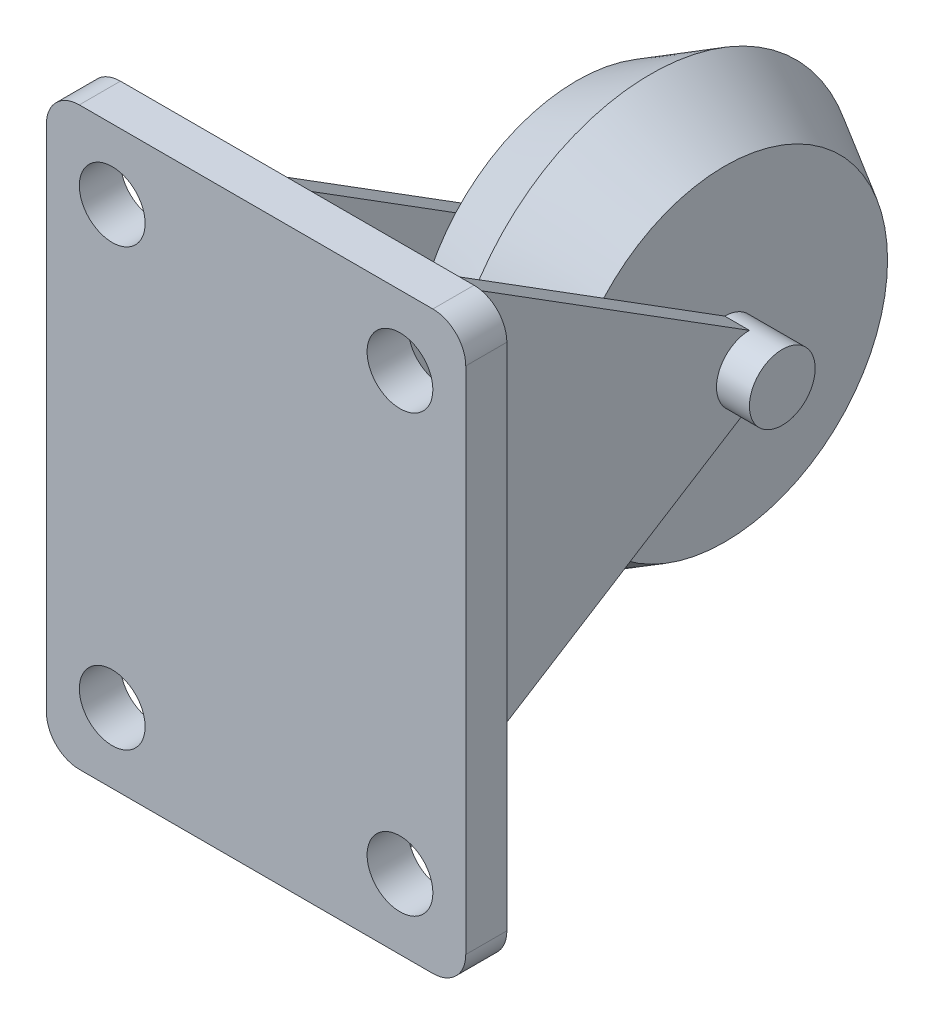
ISO-10303-21;
HEADER;
FILE_DESCRIPTION(('STEP AP214'),'2;1');
FILE_NAME('part.step','',(''),(''),'','','');
FILE_SCHEMA(('AUTOMOTIVE_DESIGN { 1 0 10303 214 1 1 1 1 }'));
ENDSEC;
DATA;
#1=APPLICATION_CONTEXT('core data for automotive mechanical design processes');
#2=APPLICATION_PROTOCOL_DEFINITION('international standard','automotive_design',2000,#1);
#3=PRODUCT_CONTEXT('',#1,'mechanical');
#4=PRODUCT('Part','Part','',(#3));
#5=PRODUCT_RELATED_PRODUCT_CATEGORY('part','',(#4));
#6=PRODUCT_DEFINITION_FORMATION('','',#4);
#7=PRODUCT_DEFINITION_CONTEXT('part definition',#1,'design');
#8=PRODUCT_DEFINITION('design','',#6,#7);
#9=PRODUCT_DEFINITION_SHAPE('','',#8);
#10=(LENGTH_UNIT() NAMED_UNIT(*) SI_UNIT(.MILLI.,.METRE.));
#11=(NAMED_UNIT(*) PLANE_ANGLE_UNIT() SI_UNIT($,.RADIAN.));
#12=(NAMED_UNIT(*) SI_UNIT($,.STERADIAN.) SOLID_ANGLE_UNIT());
#13=UNCERTAINTY_MEASURE_WITH_UNIT(LENGTH_MEASURE(1.E-05),#10,'distance_accuracy_value','');
#14=(GEOMETRIC_REPRESENTATION_CONTEXT(3) GLOBAL_UNCERTAINTY_ASSIGNED_CONTEXT((#13)) GLOBAL_UNIT_ASSIGNED_CONTEXT((#10,
#11,#12)) REPRESENTATION_CONTEXT('',''));
#15=CARTESIAN_POINT('',(0.,0.,0.));
#16=DIRECTION('',(0.,0.,1.));
#17=DIRECTION('',(1.,0.,0.));
#18=AXIS2_PLACEMENT_3D('',#15,#16,#17);
#19=CARTESIAN_POINT('',(-12.,-22.233902249806,-13.9608223429015));
#20=DIRECTION('',(0.,0.846889988853068,0.531768132535647));
#21=DIRECTION('',(0.,-0.531768132535647,0.846889988853068));
#22=AXIS2_PLACEMENT_3D('',#19,#20,#21);
#23=PLANE('',#22);
#24=DIRECTION('',(0.,-0.531768132535647,0.846889988853068));
#25=VECTOR('',#24,1.);
#26=CARTESIAN_POINT('',(-8.99999999999995,-22.2339022498061,-13.9608223429015));
#27=LINE('',#26,#25);
#28=CARTESIAN_POINT('',(-8.99999999999998,-4.,-43.));
#29=VERTEX_POINT('',#28);
#30=CARTESIAN_POINT('',(-8.99999999999995,-13.2447323242774,-28.2769077798545));
#31=VERTEX_POINT('',#30);
#32=EDGE_CURVE('E163',#29,#31,#27,.T.);
#33=ORIENTED_EDGE('',*,*,#32,.T.);
#34=CARTESIAN_POINT('',(-9.00000000000001,-31.,0.));
#35=VERTEX_POINT('',#34);
#36=EDGE_CURVE('E165',#31,#35,#27,.T.);
#37=ORIENTED_EDGE('',*,*,#36,.T.);
#38=DIRECTION('',(1.,0.,0.));
#39=VECTOR('',#38,1.);
#40=CARTESIAN_POINT('',(-12.,-31.,0.));
#41=LINE('',#40,#39);
#42=CARTESIAN_POINT('',(-12.,-31.,0.));
#43=VERTEX_POINT('',#42);
#44=EDGE_CURVE('E237',#43,#35,#41,.T.);
#45=ORIENTED_EDGE('',*,*,#44,.F.);
#46=DIRECTION('',(0.,-0.531768132535647,0.846889988853068));
#47=VECTOR('',#46,1.);
#48=CARTESIAN_POINT('',(-12.,-22.233902249806,-13.9608223429015));
#49=LINE('',#48,#47);
#50=CARTESIAN_POINT('',(-12.,-4.,-43.));
#51=VERTEX_POINT('',#50);
#52=EDGE_CURVE('E226',#51,#43,#49,.T.);
#53=ORIENTED_EDGE('',*,*,#52,.F.);
#54=DIRECTION('',(1.,0.,0.));
#55=VECTOR('',#54,1.);
#56=CARTESIAN_POINT('',(-12.,-4.,-43.));
#57=LINE('',#56,#55);
#58=EDGE_CURVE('E169',#51,#29,#57,.T.);
#59=ORIENTED_EDGE('',*,*,#58,.T.);
#60=EDGE_LOOP('',(#33,#37,#45,#53,#59));
#61=FACE_BOUND('',#60,.T.);
#62=ADVANCED_FACE('F36',(#61),#23,.F.);
#63=CARTESIAN_POINT('',(-12.,22.233902249806,-13.9608223429015));
#64=DIRECTION('',(0.,0.846889988853068,-0.531768132535647));
#65=DIRECTION('',(0.,0.531768132535647,0.846889988853069));
#66=AXIS2_PLACEMENT_3D('',#63,#64,#65);
#67=PLANE('',#66);
#68=DIRECTION('',(1.,0.,0.));
#69=VECTOR('',#68,1.);
#70=CARTESIAN_POINT('',(-12.,31.,0.));
#71=LINE('',#70,#69);
#72=CARTESIAN_POINT('',(-12.,31.,0.));
#73=VERTEX_POINT('',#72);
#74=CARTESIAN_POINT('',(-8.99999999999998,31.,0.));
#75=VERTEX_POINT('',#74);
#76=EDGE_CURVE('E241',#73,#75,#71,.T.);
#77=ORIENTED_EDGE('',*,*,#76,.T.);
#78=DIRECTION('',(0.,0.531768132535647,0.846889988853068));
#79=VECTOR('',#78,1.);
#80=CARTESIAN_POINT('',(-8.99999999999998,22.233902249806,-13.9608223429015));
#81=LINE('',#80,#79);
#82=CARTESIAN_POINT('',(-8.99999999999998,13.2447323242774,-28.2769077798545));
#83=VERTEX_POINT('',#82);
#84=EDGE_CURVE('E193',#83,#75,#81,.T.);
#85=ORIENTED_EDGE('',*,*,#84,.F.);
#86=CARTESIAN_POINT('',(-8.99999999999995,4.,-43.));
#87=VERTEX_POINT('',#86);
#88=EDGE_CURVE('E183',#87,#83,#81,.T.);
#89=ORIENTED_EDGE('',*,*,#88,.F.);
#90=DIRECTION('',(1.,0.,0.));
#91=VECTOR('',#90,1.);
#92=CARTESIAN_POINT('',(-12.,4.,-43.));
#93=LINE('',#92,#91);
#94=CARTESIAN_POINT('',(-12.,4.,-43.));
#95=VERTEX_POINT('',#94);
#96=EDGE_CURVE('E245',#95,#87,#93,.T.);
#97=ORIENTED_EDGE('',*,*,#96,.F.);
#98=DIRECTION('',(0.,0.531768132535647,0.846889988853068));
#99=VECTOR('',#98,1.);
#100=CARTESIAN_POINT('',(-12.,22.233902249806,-13.9608223429015));
#101=LINE('',#100,#99);
#102=EDGE_CURVE('E231',#95,#73,#101,.T.);
#103=ORIENTED_EDGE('',*,*,#102,.T.);
#104=EDGE_LOOP('',(#77,#85,#89,#97,#103));
#105=FACE_BOUND('',#104,.T.);
#106=ADVANCED_FACE('F377',(#105),#67,.T.);
#107=CARTESIAN_POINT('',(-16.,0.,-43.));
#108=DIRECTION('',(1.,0.,0.));
#109=DIRECTION('',(0.,0.,-1.));
#110=AXIS2_PLACEMENT_3D('',#107,#108,#109);
#111=CYLINDRICAL_SURFACE('',#110,4.);
#112=CARTESIAN_POINT('',(-16.,0.,-43.));
#113=DIRECTION('',(1.,0.,0.));
#114=DIRECTION('',(0.,0.,-1.));
#115=AXIS2_PLACEMENT_3D('',#112,#113,#114);
#116=CIRCLE('',#115,4.);
#117=CARTESIAN_POINT('',(-16.,0.,-47.));
#118=VERTEX_POINT('',#117);
#119=EDGE_CURVE('E211',#118,#118,#116,.T.);
#120=ORIENTED_EDGE('',*,*,#119,.T.);
#121=EDGE_LOOP('',(#120));
#122=FACE_BOUND('',#121,.T.);
#123=ORIENTED_EDGE('',*,*,#96,.T.);
#124=CARTESIAN_POINT('',(-8.99999999999995,0.,-43.));
#125=DIRECTION('',(1.,0.,0.));
#126=DIRECTION('',(0.,0.,-1.));
#127=AXIS2_PLACEMENT_3D('',#124,#125,#126);
#128=CIRCLE('',#127,4.);
#129=EDGE_CURVE('E173',#29,#87,#128,.T.);
#130=ORIENTED_EDGE('',*,*,#129,.F.);
#131=ORIENTED_EDGE('',*,*,#58,.F.);
#132=CARTESIAN_POINT('',(-12.,0.,-43.));
#133=DIRECTION('',(1.,0.,0.));
#134=DIRECTION('',(0.,0.,-1.));
#135=AXIS2_PLACEMENT_3D('',#132,#133,#134);
#136=CIRCLE('',#135,4.);
#137=EDGE_CURVE('E229',#95,#51,#136,.T.);
#138=ORIENTED_EDGE('',*,*,#137,.F.);
#139=EDGE_LOOP('',(#123,#130,#131,#138));
#140=FACE_BOUND('',#139,.T.);
#141=ADVANCED_FACE('F383',(#122,#140),#111,.T.);
#142=CARTESIAN_POINT('',(-21.5,-31.,0.));
#143=DIRECTION('',(0.,0.,-1.));
#144=DIRECTION('',(-1.,0.,0.));
#145=AXIS2_PLACEMENT_3D('',#142,#143,#144);
#146=PLANE('',#145);
#147=ORIENTED_EDGE('',*,*,#44,.T.);
#148=DIRECTION('',(0.,-1.,0.));
#149=VECTOR('',#148,1.);
#150=CARTESIAN_POINT('',(-8.99999999999995,0.,0.));
#151=LINE('',#150,#149);
#152=EDGE_CURVE('E177',#75,#35,#151,.T.);
#153=ORIENTED_EDGE('',*,*,#152,.F.);
#154=ORIENTED_EDGE('',*,*,#76,.F.);
#155=DIRECTION('',(0.,-1.,0.));
#156=VECTOR('',#155,1.);
#157=CARTESIAN_POINT('',(-12.,0.,0.));
#158=LINE('',#157,#156);
#159=EDGE_CURVE('E234',#73,#43,#158,.T.);
#160=ORIENTED_EDGE('',*,*,#159,.T.);
#161=EDGE_LOOP('',(#147,#153,#154,#160));
#162=FACE_BOUND('',#161,.T.);
#163=CARTESIAN_POINT('',(17.5,-26.5,0.));
#164=DIRECTION('',(0.,0.,1.));
#165=DIRECTION('',(1.,0.,0.));
#166=AXIS2_PLACEMENT_3D('',#163,#164,#165);
#167=CIRCLE('',#166,4.);
#168=CARTESIAN_POINT('',(21.5,-26.5,0.));
#169=VERTEX_POINT('',#168);
#170=EDGE_CURVE('E253',#169,#169,#167,.T.);
#171=ORIENTED_EDGE('',*,*,#170,.T.);
#172=EDGE_LOOP('',(#171));
#173=FACE_BOUND('',#172,.T.);
#174=CARTESIAN_POINT('',(-17.5,26.5,0.));
#175=DIRECTION('',(0.,0.,1.));
#176=DIRECTION('',(1.,0.,0.));
#177=AXIS2_PLACEMENT_3D('',#174,#175,#176);
#178=CIRCLE('',#177,4.);
#179=CARTESIAN_POINT('',(-13.5,26.5,0.));
#180=VERTEX_POINT('',#179);
#181=EDGE_CURVE('E265',#180,#180,#178,.T.);
#182=ORIENTED_EDGE('',*,*,#181,.T.);
#183=EDGE_LOOP('',(#182));
#184=FACE_BOUND('',#183,.T.);
#185=CARTESIAN_POINT('',(-21.5,-31.,0.));
#186=DIRECTION('',(0.,0.,1.));
#187=DIRECTION('',(-1.,0.,0.));
#188=AXIS2_PLACEMENT_3D('',#185,#186,#187);
#189=CIRCLE('',#188,4.);
#190=CARTESIAN_POINT('',(-25.5,-31.,0.));
#191=VERTEX_POINT('',#190);
#192=CARTESIAN_POINT('',(-21.4999999999999,-35.,0.));
#193=VERTEX_POINT('',#192);
#194=EDGE_CURVE('E271',#191,#193,#189,.T.);
#195=ORIENTED_EDGE('',*,*,#194,.F.);
#196=DIRECTION('',(0.,-1.,0.));
#197=VECTOR('',#196,1.);
#198=CARTESIAN_POINT('',(-25.5,-31.,0.));
#199=LINE('',#198,#197);
#200=CARTESIAN_POINT('',(-25.5,31.,0.));
#201=VERTEX_POINT('',#200);
#202=EDGE_CURVE('E278',#201,#191,#199,.T.);
#203=ORIENTED_EDGE('',*,*,#202,.F.);
#204=CARTESIAN_POINT('',(-21.5,31.,0.));
#205=DIRECTION('',(0.,0.,1.));
#206=DIRECTION('',(-1.,0.,0.));
#207=AXIS2_PLACEMENT_3D('',#204,#205,#206);
#208=CIRCLE('',#207,4.);
#209=CARTESIAN_POINT('',(-21.4999999999999,35.,0.));
#210=VERTEX_POINT('',#209);
#211=EDGE_CURVE('E305',#210,#201,#208,.T.);
#212=ORIENTED_EDGE('',*,*,#211,.F.);
#213=DIRECTION('',(-1.,0.,0.));
#214=VECTOR('',#213,1.);
#215=CARTESIAN_POINT('',(21.5,35.,0.));
#216=LINE('',#215,#214);
#217=CARTESIAN_POINT('',(21.5,35.,0.));
#218=VERTEX_POINT('',#217);
#219=EDGE_CURVE('E303',#218,#210,#216,.T.);
#220=ORIENTED_EDGE('',*,*,#219,.F.);
#221=CARTESIAN_POINT('',(21.5,31.,0.));
#222=DIRECTION('',(0.,0.,1.));
#223=DIRECTION('',(1.,0.,0.));
#224=AXIS2_PLACEMENT_3D('',#221,#222,#223);
#225=CIRCLE('',#224,4.);
#226=CARTESIAN_POINT('',(25.5,31.,0.));
#227=VERTEX_POINT('',#226);
#228=EDGE_CURVE('E301',#227,#218,#225,.T.);
#229=ORIENTED_EDGE('',*,*,#228,.F.);
#230=DIRECTION('',(0.,1.,0.));
#231=VECTOR('',#230,1.);
#232=CARTESIAN_POINT('',(25.5,-31.,0.));
#233=LINE('',#232,#231);
#234=CARTESIAN_POINT('',(25.5,-31.,0.));
#235=VERTEX_POINT('',#234);
#236=EDGE_CURVE('E299',#235,#227,#233,.T.);
#237=ORIENTED_EDGE('',*,*,#236,.F.);
#238=CARTESIAN_POINT('',(21.5,-31.,0.));
#239=DIRECTION('',(0.,0.,1.));
#240=DIRECTION('',(1.,0.,0.));
#241=AXIS2_PLACEMENT_3D('',#238,#239,#240);
#242=CIRCLE('',#241,4.);
#243=CARTESIAN_POINT('',(21.5,-35.,0.));
#244=VERTEX_POINT('',#243);
#245=EDGE_CURVE('E297',#244,#235,#242,.T.);
#246=ORIENTED_EDGE('',*,*,#245,.F.);
#247=DIRECTION('',(1.,0.,0.));
#248=VECTOR('',#247,1.);
#249=CARTESIAN_POINT('',(21.5,-35.,0.));
#250=LINE('',#249,#248);
#251=EDGE_CURVE('E295',#193,#244,#250,.T.);
#252=ORIENTED_EDGE('',*,*,#251,.F.);
#253=EDGE_LOOP('',(#195,#203,#212,#220,#229,#237,#246,#252));
#254=FACE_BOUND('',#253,.T.);
#255=CARTESIAN_POINT('',(17.5,26.5,0.));
#256=DIRECTION('',(0.,0.,1.));
#257=DIRECTION('',(1.,0.,0.));
#258=AXIS2_PLACEMENT_3D('',#255,#256,#257);
#259=CIRCLE('',#258,4.);
#260=CARTESIAN_POINT('',(21.5,26.5,0.));
#261=VERTEX_POINT('',#260);
#262=EDGE_CURVE('E259',#261,#261,#259,.T.);
#263=ORIENTED_EDGE('',*,*,#262,.T.);
#264=EDGE_LOOP('',(#263));
#265=FACE_BOUND('',#264,.T.);
#266=CARTESIAN_POINT('',(-17.5,-26.5,0.));
#267=DIRECTION('',(0.,0.,1.));
#268=DIRECTION('',(1.,0.,0.));
#269=AXIS2_PLACEMENT_3D('',#266,#267,#268);
#270=CIRCLE('',#269,4.);
#271=CARTESIAN_POINT('',(-13.5,-26.5,0.));
#272=VERTEX_POINT('',#271);
#273=EDGE_CURVE('E239',#272,#272,#270,.T.);
#274=ORIENTED_EDGE('',*,*,#273,.T.);
#275=EDGE_LOOP('',(#274));
#276=FACE_BOUND('',#275,.T.);
#277=DIRECTION('',(0.,-1.,0.));
#278=VECTOR('',#277,1.);
#279=CARTESIAN_POINT('',(9.00000000000001,0.,0.));
#280=LINE('',#279,#278);
#281=CARTESIAN_POINT('',(9.00000000000001,31.,0.));
#282=VERTEX_POINT('',#281);
#283=CARTESIAN_POINT('',(9.00000000000001,-31.,0.));
#284=VERTEX_POINT('',#283);
#285=EDGE_CURVE('E205',#282,#284,#280,.T.);
#286=ORIENTED_EDGE('',*,*,#285,.T.);
#287=CARTESIAN_POINT('',(12.,-31.,0.));
#288=VERTEX_POINT('',#287);
#289=EDGE_CURVE('E240',#284,#288,#41,.T.);
#290=ORIENTED_EDGE('',*,*,#289,.T.);
#291=DIRECTION('',(0.,-1.,0.));
#292=VECTOR('',#291,1.);
#293=CARTESIAN_POINT('',(12.,0.,0.));
#294=LINE('',#293,#292);
#295=CARTESIAN_POINT('',(12.,31.,0.));
#296=VERTEX_POINT('',#295);
#297=EDGE_CURVE('E223',#296,#288,#294,.T.);
#298=ORIENTED_EDGE('',*,*,#297,.F.);
#299=EDGE_CURVE('E244',#282,#296,#71,.T.);
#300=ORIENTED_EDGE('',*,*,#299,.F.);
#301=EDGE_LOOP('',(#286,#290,#298,#300));
#302=FACE_BOUND('',#301,.T.);
#303=ADVANCED_FACE('F335',(#162,#173,#184,#254,#265,#276,#302),#146,.T.);
#304=CARTESIAN_POINT('',(-21.5,-31.,5.));
#305=DIRECTION('',(0.,0.,-1.));
#306=DIRECTION('',(-1.,0.,0.));
#307=AXIS2_PLACEMENT_3D('',#304,#305,#306);
#308=PLANE('',#307);
#309=CARTESIAN_POINT('',(-21.5,-31.,5.));
#310=DIRECTION('',(0.,0.,1.));
#311=DIRECTION('',(-1.,0.,0.));
#312=AXIS2_PLACEMENT_3D('',#309,#310,#311);
#313=CIRCLE('',#312,4.);
#314=CARTESIAN_POINT('',(-25.5,-31.,5.));
#315=VERTEX_POINT('',#314);
#316=CARTESIAN_POINT('',(-21.4999999999999,-35.,5.));
#317=VERTEX_POINT('',#316);
#318=EDGE_CURVE('E274',#315,#317,#313,.T.);
#319=ORIENTED_EDGE('',*,*,#318,.T.);
#320=DIRECTION('',(1.,0.,0.));
#321=VECTOR('',#320,1.);
#322=CARTESIAN_POINT('',(21.5,-35.,5.));
#323=LINE('',#322,#321);
#324=CARTESIAN_POINT('',(21.5,-35.,5.));
#325=VERTEX_POINT('',#324);
#326=EDGE_CURVE('E277',#317,#325,#323,.T.);
#327=ORIENTED_EDGE('',*,*,#326,.T.);
#328=CARTESIAN_POINT('',(21.5,-31.,5.));
#329=DIRECTION('',(0.,0.,1.));
#330=DIRECTION('',(1.,0.,0.));
#331=AXIS2_PLACEMENT_3D('',#328,#329,#330);
#332=CIRCLE('',#331,4.);
#333=CARTESIAN_POINT('',(25.5,-31.,5.));
#334=VERTEX_POINT('',#333);
#335=EDGE_CURVE('E280',#325,#334,#332,.T.);
#336=ORIENTED_EDGE('',*,*,#335,.T.);
#337=DIRECTION('',(0.,1.,0.));
#338=VECTOR('',#337,1.);
#339=CARTESIAN_POINT('',(25.5,-31.,5.));
#340=LINE('',#339,#338);
#341=CARTESIAN_POINT('',(25.5,31.,5.));
#342=VERTEX_POINT('',#341);
#343=EDGE_CURVE('E282',#334,#342,#340,.T.);
#344=ORIENTED_EDGE('',*,*,#343,.T.);
#345=CARTESIAN_POINT('',(21.5,31.,5.));
#346=DIRECTION('',(0.,0.,1.));
#347=DIRECTION('',(1.,0.,0.));
#348=AXIS2_PLACEMENT_3D('',#345,#346,#347);
#349=CIRCLE('',#348,4.);
#350=CARTESIAN_POINT('',(21.5,35.,5.));
#351=VERTEX_POINT('',#350);
#352=EDGE_CURVE('E284',#342,#351,#349,.T.);
#353=ORIENTED_EDGE('',*,*,#352,.T.);
#354=DIRECTION('',(-1.,0.,0.));
#355=VECTOR('',#354,1.);
#356=CARTESIAN_POINT('',(21.5,35.,5.));
#357=LINE('',#356,#355);
#358=CARTESIAN_POINT('',(-21.4999999999999,35.,5.));
#359=VERTEX_POINT('',#358);
#360=EDGE_CURVE('E286',#351,#359,#357,.T.);
#361=ORIENTED_EDGE('',*,*,#360,.T.);
#362=CARTESIAN_POINT('',(-21.5,31.,5.));
#363=DIRECTION('',(0.,0.,1.));
#364=DIRECTION('',(-1.,0.,0.));
#365=AXIS2_PLACEMENT_3D('',#362,#363,#364);
#366=CIRCLE('',#365,4.);
#367=CARTESIAN_POINT('',(-25.5,31.,5.));
#368=VERTEX_POINT('',#367);
#369=EDGE_CURVE('E288',#359,#368,#366,.T.);
#370=ORIENTED_EDGE('',*,*,#369,.T.);
#371=DIRECTION('',(0.,-1.,0.));
#372=VECTOR('',#371,1.);
#373=CARTESIAN_POINT('',(-25.5,-31.,5.));
#374=LINE('',#373,#372);
#375=EDGE_CURVE('E290',#368,#315,#374,.T.);
#376=ORIENTED_EDGE('',*,*,#375,.T.);
#377=EDGE_LOOP('',(#319,#327,#336,#344,#353,#361,#370,#376));
#378=FACE_BOUND('',#377,.T.);
#379=CARTESIAN_POINT('',(-17.5,26.5,5.));
#380=DIRECTION('',(0.,0.,1.));
#381=DIRECTION('',(1.,0.,0.));
#382=AXIS2_PLACEMENT_3D('',#379,#380,#381);
#383=CIRCLE('',#382,4.);
#384=CARTESIAN_POINT('',(-13.5,26.5,5.));
#385=VERTEX_POINT('',#384);
#386=EDGE_CURVE('E268',#385,#385,#383,.T.);
#387=ORIENTED_EDGE('',*,*,#386,.F.);
#388=EDGE_LOOP('',(#387));
#389=FACE_BOUND('',#388,.T.);
#390=CARTESIAN_POINT('',(17.5,26.5,5.));
#391=DIRECTION('',(0.,0.,1.));
#392=DIRECTION('',(1.,0.,0.));
#393=AXIS2_PLACEMENT_3D('',#390,#391,#392);
#394=CIRCLE('',#393,4.);
#395=CARTESIAN_POINT('',(21.5,26.5,5.));
#396=VERTEX_POINT('',#395);
#397=EDGE_CURVE('E262',#396,#396,#394,.T.);
#398=ORIENTED_EDGE('',*,*,#397,.F.);
#399=EDGE_LOOP('',(#398));
#400=FACE_BOUND('',#399,.T.);
#401=CARTESIAN_POINT('',(17.5,-26.5,5.));
#402=DIRECTION('',(0.,0.,1.));
#403=DIRECTION('',(1.,0.,0.));
#404=AXIS2_PLACEMENT_3D('',#401,#402,#403);
#405=CIRCLE('',#404,4.);
#406=CARTESIAN_POINT('',(21.5,-26.5,5.));
#407=VERTEX_POINT('',#406);
#408=EDGE_CURVE('E256',#407,#407,#405,.T.);
#409=ORIENTED_EDGE('',*,*,#408,.F.);
#410=EDGE_LOOP('',(#409));
#411=FACE_BOUND('',#410,.T.);
#412=CARTESIAN_POINT('',(-17.5,-26.5,5.));
#413=DIRECTION('',(0.,0.,1.));
#414=DIRECTION('',(1.,0.,0.));
#415=AXIS2_PLACEMENT_3D('',#412,#413,#414);
#416=CIRCLE('',#415,4.);
#417=CARTESIAN_POINT('',(-13.5,-26.5,5.));
#418=VERTEX_POINT('',#417);
#419=EDGE_CURVE('E250',#418,#418,#416,.T.);
#420=ORIENTED_EDGE('',*,*,#419,.F.);
#421=EDGE_LOOP('',(#420));
#422=FACE_BOUND('',#421,.T.);
#423=ADVANCED_FACE('F349',(#378,#389,#400,#411,#422),#308,.F.);
#424=CARTESIAN_POINT('',(-21.5,-31.,5.));
#425=DIRECTION('',(0.,0.,-1.));
#426=DIRECTION('',(-1.,0.,0.));
#427=AXIS2_PLACEMENT_3D('',#424,#425,#426);
#428=CYLINDRICAL_SURFACE('',#427,4.);
#429=ORIENTED_EDGE('',*,*,#194,.T.);
#430=DIRECTION('',(0.,0.,-1.));
#431=VECTOR('',#430,1.);
#432=CARTESIAN_POINT('',(-21.4999999999999,-35.,5.));
#433=LINE('',#432,#431);
#434=EDGE_CURVE('E11',#317,#193,#433,.T.);
#435=ORIENTED_EDGE('',*,*,#434,.F.);
#436=ORIENTED_EDGE('',*,*,#318,.F.);
#437=DIRECTION('',(0.,0.,-1.));
#438=VECTOR('',#437,1.);
#439=CARTESIAN_POINT('',(-25.5,-31.,5.));
#440=LINE('',#439,#438);
#441=EDGE_CURVE('E292',#315,#191,#440,.T.);
#442=ORIENTED_EDGE('',*,*,#441,.T.);
#443=EDGE_LOOP('',(#429,#435,#436,#442));
#444=FACE_BOUND('',#443,.T.);
#445=ADVANCED_FACE('F38',(#444),#428,.T.);
#446=CARTESIAN_POINT('',(21.5,-35.,5.));
#447=DIRECTION('',(0.,1.,0.));
#448=DIRECTION('',(0.,0.,1.));
#449=AXIS2_PLACEMENT_3D('',#446,#447,#448);
#450=PLANE('',#449);
#451=ORIENTED_EDGE('',*,*,#251,.T.);
#452=DIRECTION('',(0.,0.,-1.));
#453=VECTOR('',#452,1.);
#454=CARTESIAN_POINT('',(21.5,-35.,5.));
#455=LINE('',#454,#453);
#456=EDGE_CURVE('E44',#325,#244,#455,.T.);
#457=ORIENTED_EDGE('',*,*,#456,.F.);
#458=ORIENTED_EDGE('',*,*,#326,.F.);
#459=ORIENTED_EDGE('',*,*,#434,.T.);
#460=EDGE_LOOP('',(#451,#457,#458,#459));
#461=FACE_BOUND('',#460,.T.);
#462=ADVANCED_FACE('F354',(#461),#450,.F.);
#463=CARTESIAN_POINT('',(21.5,-31.,5.));
#464=DIRECTION('',(0.,0.,-1.));
#465=DIRECTION('',(-1.,0.,0.));
#466=AXIS2_PLACEMENT_3D('',#463,#464,#465);
#467=CYLINDRICAL_SURFACE('',#466,4.);
#468=ORIENTED_EDGE('',*,*,#245,.T.);
#469=DIRECTION('',(0.,0.,-1.));
#470=VECTOR('',#469,1.);
#471=CARTESIAN_POINT('',(25.5,-31.,5.));
#472=LINE('',#471,#470);
#473=EDGE_CURVE('E322',#334,#235,#472,.T.);
#474=ORIENTED_EDGE('',*,*,#473,.F.);
#475=ORIENTED_EDGE('',*,*,#335,.F.);
#476=ORIENTED_EDGE('',*,*,#456,.T.);
#477=EDGE_LOOP('',(#468,#474,#475,#476));
#478=FACE_BOUND('',#477,.T.);
#479=ADVANCED_FACE('F329',(#478),#467,.T.);
#480=CARTESIAN_POINT('',(25.5,-31.,5.));
#481=DIRECTION('',(-1.,0.,0.));
#482=DIRECTION('',(0.,0.,1.));
#483=AXIS2_PLACEMENT_3D('',#480,#481,#482);
#484=PLANE('',#483);
#485=ORIENTED_EDGE('',*,*,#236,.T.);
#486=DIRECTION('',(0.,0.,-1.));
#487=VECTOR('',#486,1.);
#488=CARTESIAN_POINT('',(25.5,31.,5.));
#489=LINE('',#488,#487);
#490=EDGE_CURVE('E319',#342,#227,#489,.T.);
#491=ORIENTED_EDGE('',*,*,#490,.F.);
#492=ORIENTED_EDGE('',*,*,#343,.F.);
#493=ORIENTED_EDGE('',*,*,#473,.T.);
#494=EDGE_LOOP('',(#485,#491,#492,#493));
#495=FACE_BOUND('',#494,.T.);
#496=ADVANCED_FACE('F341',(#495),#484,.F.);
#497=CARTESIAN_POINT('',(21.5,31.,5.));
#498=DIRECTION('',(0.,0.,-1.));
#499=DIRECTION('',(-1.,0.,0.));
#500=AXIS2_PLACEMENT_3D('',#497,#498,#499);
#501=CYLINDRICAL_SURFACE('',#500,4.);
#502=ORIENTED_EDGE('',*,*,#228,.T.);
#503=DIRECTION('',(0.,0.,-1.));
#504=VECTOR('',#503,1.);
#505=CARTESIAN_POINT('',(21.5,35.,5.));
#506=LINE('',#505,#504);
#507=EDGE_CURVE('E316',#351,#218,#506,.T.);
#508=ORIENTED_EDGE('',*,*,#507,.F.);
#509=ORIENTED_EDGE('',*,*,#352,.F.);
#510=ORIENTED_EDGE('',*,*,#490,.T.);
#511=EDGE_LOOP('',(#502,#508,#509,#510));
#512=FACE_BOUND('',#511,.T.);
#513=ADVANCED_FACE('F345',(#512),#501,.T.);
#514=CARTESIAN_POINT('',(21.5,35.,5.));
#515=DIRECTION('',(0.,-1.,0.));
#516=DIRECTION('',(0.,0.,-1.));
#517=AXIS2_PLACEMENT_3D('',#514,#515,#516);
#518=PLANE('',#517);
#519=ORIENTED_EDGE('',*,*,#219,.T.);
#520=DIRECTION('',(0.,0.,-1.));
#521=VECTOR('',#520,1.);
#522=CARTESIAN_POINT('',(-21.4999999999999,35.,5.));
#523=LINE('',#522,#521);
#524=EDGE_CURVE('E313',#359,#210,#523,.T.);
#525=ORIENTED_EDGE('',*,*,#524,.F.);
#526=ORIENTED_EDGE('',*,*,#360,.F.);
#527=ORIENTED_EDGE('',*,*,#507,.T.);
#528=EDGE_LOOP('',(#519,#525,#526,#527));
#529=FACE_BOUND('',#528,.T.);
#530=ADVANCED_FACE('F367',(#529),#518,.F.);
#531=CARTESIAN_POINT('',(-21.5,31.,5.));
#532=DIRECTION('',(0.,0.,-1.));
#533=DIRECTION('',(-1.,0.,0.));
#534=AXIS2_PLACEMENT_3D('',#531,#532,#533);
#535=CYLINDRICAL_SURFACE('',#534,4.);
#536=ORIENTED_EDGE('',*,*,#211,.T.);
#537=DIRECTION('',(0.,0.,-1.));
#538=VECTOR('',#537,1.);
#539=CARTESIAN_POINT('',(-25.5,31.,5.));
#540=LINE('',#539,#538);
#541=EDGE_CURVE('E310',#368,#201,#540,.T.);
#542=ORIENTED_EDGE('',*,*,#541,.F.);
#543=ORIENTED_EDGE('',*,*,#369,.F.);
#544=ORIENTED_EDGE('',*,*,#524,.T.);
#545=EDGE_LOOP('',(#536,#542,#543,#544));
#546=FACE_BOUND('',#545,.T.);
#547=ADVANCED_FACE('F365',(#546),#535,.T.);
#548=CARTESIAN_POINT('',(-25.5,-31.,5.));
#549=DIRECTION('',(1.,0.,0.));
#550=DIRECTION('',(0.,0.,-1.));
#551=AXIS2_PLACEMENT_3D('',#548,#549,#550);
#552=PLANE('',#551);
#553=ORIENTED_EDGE('',*,*,#202,.T.);
#554=ORIENTED_EDGE('',*,*,#441,.F.);
#555=ORIENTED_EDGE('',*,*,#375,.F.);
#556=ORIENTED_EDGE('',*,*,#541,.T.);
#557=EDGE_LOOP('',(#553,#554,#555,#556));
#558=FACE_BOUND('',#557,.T.);
#559=ADVANCED_FACE('F360',(#558),#552,.F.);
#560=CARTESIAN_POINT('',(-17.5,26.5,5.));
#561=DIRECTION('',(0.,0.,-1.));
#562=DIRECTION('',(-1.,0.,0.));
#563=AXIS2_PLACEMENT_3D('',#560,#561,#562);
#564=CYLINDRICAL_SURFACE('',#563,4.);
#565=ORIENTED_EDGE('',*,*,#386,.T.);
#566=EDGE_LOOP('',(#565));
#567=FACE_BOUND('',#566,.T.);
#568=ORIENTED_EDGE('',*,*,#181,.F.);
#569=EDGE_LOOP('',(#568));
#570=FACE_BOUND('',#569,.T.);
#571=ADVANCED_FACE('F459',(#567,#570),#564,.F.);
#572=CARTESIAN_POINT('',(17.5,26.5,5.));
#573=DIRECTION('',(0.,0.,-1.));
#574=DIRECTION('',(-1.,0.,0.));
#575=AXIS2_PLACEMENT_3D('',#572,#573,#574);
#576=CYLINDRICAL_SURFACE('',#575,4.);
#577=ORIENTED_EDGE('',*,*,#397,.T.);
#578=EDGE_LOOP('',(#577));
#579=FACE_BOUND('',#578,.T.);
#580=ORIENTED_EDGE('',*,*,#262,.F.);
#581=EDGE_LOOP('',(#580));
#582=FACE_BOUND('',#581,.T.);
#583=ADVANCED_FACE('F463',(#579,#582),#576,.F.);
#584=CARTESIAN_POINT('',(17.5,-26.5,5.));
#585=DIRECTION('',(0.,0.,-1.));
#586=DIRECTION('',(-1.,0.,0.));
#587=AXIS2_PLACEMENT_3D('',#584,#585,#586);
#588=CYLINDRICAL_SURFACE('',#587,4.);
#589=ORIENTED_EDGE('',*,*,#408,.T.);
#590=EDGE_LOOP('',(#589));
#591=FACE_BOUND('',#590,.T.);
#592=ORIENTED_EDGE('',*,*,#170,.F.);
#593=EDGE_LOOP('',(#592));
#594=FACE_BOUND('',#593,.T.);
#595=ADVANCED_FACE('F397',(#591,#594),#588,.F.);
#596=CARTESIAN_POINT('',(-17.5,-26.5,5.));
#597=DIRECTION('',(0.,0.,-1.));
#598=DIRECTION('',(-1.,0.,0.));
#599=AXIS2_PLACEMENT_3D('',#596,#597,#598);
#600=CYLINDRICAL_SURFACE('',#599,4.);
#601=ORIENTED_EDGE('',*,*,#419,.T.);
#602=EDGE_LOOP('',(#601));
#603=FACE_BOUND('',#602,.T.);
#604=ORIENTED_EDGE('',*,*,#273,.F.);
#605=EDGE_LOOP('',(#604));
#606=FACE_BOUND('',#605,.T.);
#607=ADVANCED_FACE('F389',(#603,#606),#600,.F.);
#608=ORIENTED_EDGE('',*,*,#289,.F.);
#609=DIRECTION('',(0.,-0.531768132535647,0.846889988853068));
#610=VECTOR('',#609,1.);
#611=CARTESIAN_POINT('',(9.00000000000004,-22.2339022498061,-13.9608223429015));
#612=LINE('',#611,#610);
#613=CARTESIAN_POINT('',(9.00000000000001,-13.2447323242774,-28.2769077798545));
#614=VERTEX_POINT('',#613);
#615=EDGE_CURVE('E196',#614,#284,#612,.T.);
#616=ORIENTED_EDGE('',*,*,#615,.F.);
#617=CARTESIAN_POINT('',(9.00000000000001,-4.,-43.));
#618=VERTEX_POINT('',#617);
#619=EDGE_CURVE('E197',#618,#614,#612,.T.);
#620=ORIENTED_EDGE('',*,*,#619,.F.);
#621=CARTESIAN_POINT('',(12.,-4.,-43.));
#622=VERTEX_POINT('',#621);
#623=EDGE_CURVE('E236',#618,#622,#57,.T.);
#624=ORIENTED_EDGE('',*,*,#623,.T.);
#625=DIRECTION('',(0.,-0.531768132535647,0.846889988853068));
#626=VECTOR('',#625,1.);
#627=CARTESIAN_POINT('',(12.,-22.233902249806,-13.9608223429015));
#628=LINE('',#627,#626);
#629=EDGE_CURVE('E214',#622,#288,#628,.T.);
#630=ORIENTED_EDGE('',*,*,#629,.T.);
#631=EDGE_LOOP('',(#608,#616,#620,#624,#630));
#632=FACE_BOUND('',#631,.T.);
#633=ADVANCED_FACE('F379',(#632),#23,.F.);
#634=DIRECTION('',(0.,0.531768132535647,0.846889988853068));
#635=VECTOR('',#634,1.);
#636=CARTESIAN_POINT('',(9.00000000000004,22.233902249806,-13.9608223429015));
#637=LINE('',#636,#635);
#638=CARTESIAN_POINT('',(9.00000000000001,4.,-43.));
#639=VERTEX_POINT('',#638);
#640=CARTESIAN_POINT('',(9.00000000000004,13.2447323242774,-28.2769077798545));
#641=VERTEX_POINT('',#640);
#642=EDGE_CURVE('E203',#639,#641,#637,.T.);
#643=ORIENTED_EDGE('',*,*,#642,.T.);
#644=EDGE_CURVE('E202',#641,#282,#637,.T.);
#645=ORIENTED_EDGE('',*,*,#644,.T.);
#646=ORIENTED_EDGE('',*,*,#299,.T.);
#647=DIRECTION('',(0.,0.531768132535647,0.846889988853068));
#648=VECTOR('',#647,1.);
#649=CARTESIAN_POINT('',(12.,22.233902249806,-13.9608223429015));
#650=LINE('',#649,#648);
#651=CARTESIAN_POINT('',(12.,4.,-43.));
#652=VERTEX_POINT('',#651);
#653=EDGE_CURVE('E220',#652,#296,#650,.T.);
#654=ORIENTED_EDGE('',*,*,#653,.F.);
#655=EDGE_CURVE('E248',#639,#652,#93,.T.);
#656=ORIENTED_EDGE('',*,*,#655,.F.);
#657=EDGE_LOOP('',(#643,#645,#646,#654,#656));
#658=FACE_BOUND('',#657,.T.);
#659=ADVANCED_FACE('F386',(#658),#67,.T.);
#660=CARTESIAN_POINT('',(-12.,0.,0.));
#661=DIRECTION('',(1.,0.,0.));
#662=DIRECTION('',(0.,0.,-1.));
#663=AXIS2_PLACEMENT_3D('',#660,#661,#662);
#664=PLANE('',#663);
#665=ORIENTED_EDGE('',*,*,#52,.T.);
#666=ORIENTED_EDGE('',*,*,#159,.F.);
#667=ORIENTED_EDGE('',*,*,#102,.F.);
#668=ORIENTED_EDGE('',*,*,#137,.T.);
#669=EDGE_LOOP('',(#665,#666,#667,#668));
#670=FACE_BOUND('',#669,.T.);
#671=ADVANCED_FACE('F395',(#670),#664,.F.);
#672=CARTESIAN_POINT('',(12.,0.,0.));
#673=DIRECTION('',(1.,0.,0.));
#674=DIRECTION('',(0.,0.,-1.));
#675=AXIS2_PLACEMENT_3D('',#672,#673,#674);
#676=PLANE('',#675);
#677=ORIENTED_EDGE('',*,*,#629,.F.);
#678=CARTESIAN_POINT('',(12.,0.,-43.));
#679=DIRECTION('',(1.,0.,0.));
#680=DIRECTION('',(0.,0.,-1.));
#681=AXIS2_PLACEMENT_3D('',#678,#679,#680);
#682=CIRCLE('',#681,4.);
#683=EDGE_CURVE('E217',#652,#622,#682,.T.);
#684=ORIENTED_EDGE('',*,*,#683,.F.);
#685=ORIENTED_EDGE('',*,*,#653,.T.);
#686=ORIENTED_EDGE('',*,*,#297,.T.);
#687=EDGE_LOOP('',(#677,#684,#685,#686));
#688=FACE_BOUND('',#687,.T.);
#689=ADVANCED_FACE('F406',(#688),#676,.T.);
#690=CARTESIAN_POINT('',(9.00000000000001,0.,-43.));
#691=DIRECTION('',(1.,0.,0.));
#692=DIRECTION('',(0.,0.,-1.));
#693=AXIS2_PLACEMENT_3D('',#690,#691,#692);
#694=CIRCLE('',#693,4.);
#695=EDGE_CURVE('E200',#618,#639,#694,.T.);
#696=ORIENTED_EDGE('',*,*,#695,.T.);
#697=ORIENTED_EDGE('',*,*,#655,.T.);
#698=ORIENTED_EDGE('',*,*,#683,.T.);
#699=ORIENTED_EDGE('',*,*,#623,.F.);
#700=EDGE_LOOP('',(#696,#697,#698,#699));
#701=FACE_BOUND('',#700,.T.);
#702=CARTESIAN_POINT('',(16.,0.,-43.));
#703=DIRECTION('',(1.,0.,0.));
#704=DIRECTION('',(0.,0.,-1.));
#705=AXIS2_PLACEMENT_3D('',#702,#703,#704);
#706=CIRCLE('',#705,4.);
#707=CARTESIAN_POINT('',(16.,0.,-47.));
#708=VERTEX_POINT('',#707);
#709=EDGE_CURVE('E208',#708,#708,#706,.T.);
#710=ORIENTED_EDGE('',*,*,#709,.F.);
#711=EDGE_LOOP('',(#710));
#712=FACE_BOUND('',#711,.T.);
#713=ADVANCED_FACE('F428',(#701,#712),#111,.T.);
#714=CARTESIAN_POINT('',(-16.,0.,0.));
#715=DIRECTION('',(1.,0.,0.));
#716=DIRECTION('',(0.,0.,-1.));
#717=AXIS2_PLACEMENT_3D('',#714,#715,#716);
#718=PLANE('',#717);
#719=ORIENTED_EDGE('',*,*,#119,.F.);
#720=EDGE_LOOP('',(#719));
#721=FACE_BOUND('',#720,.T.);
#722=ADVANCED_FACE('F421',(#721),#718,.F.);
#723=CARTESIAN_POINT('',(16.,0.,0.));
#724=DIRECTION('',(1.,0.,0.));
#725=DIRECTION('',(0.,0.,-1.));
#726=AXIS2_PLACEMENT_3D('',#723,#724,#725);
#727=PLANE('',#726);
#728=ORIENTED_EDGE('',*,*,#709,.T.);
#729=EDGE_LOOP('',(#728));
#730=FACE_BOUND('',#729,.T.);
#731=ADVANCED_FACE('F414',(#730),#727,.T.);
#732=CARTESIAN_POINT('',(9.00000000000001,0.,0.));
#733=DIRECTION('',(1.,0.,0.));
#734=DIRECTION('',(0.,0.,-1.));
#735=AXIS2_PLACEMENT_3D('',#732,#733,#734);
#736=PLANE('',#735);
#737=CARTESIAN_POINT('',(9.00000000000001,0.,-43.));
#738=DIRECTION('',(1.,0.,0.));
#739=DIRECTION('',(0.,0.,-1.));
#740=AXIS2_PLACEMENT_3D('',#737,#738,#739);
#741=CIRCLE('',#740,19.8038475772934);
#742=EDGE_CURVE('E51',#641,#614,#741,.T.);
#743=ORIENTED_EDGE('',*,*,#742,.T.);
#744=ORIENTED_EDGE('',*,*,#615,.T.);
#745=ORIENTED_EDGE('',*,*,#285,.F.);
#746=ORIENTED_EDGE('',*,*,#644,.F.);
#747=EDGE_LOOP('',(#743,#744,#745,#746));
#748=FACE_BOUND('',#747,.T.);
#749=ADVANCED_FACE('F412',(#748),#736,.F.);
#750=CARTESIAN_POINT('',(-8.99999999999995,0.,0.));
#751=DIRECTION('',(1.,0.,0.));
#752=DIRECTION('',(0.,0.,-1.));
#753=AXIS2_PLACEMENT_3D('',#750,#751,#752);
#754=PLANE('',#753);
#755=CARTESIAN_POINT('',(-8.99999999999995,0.,-43.));
#756=DIRECTION('',(1.,0.,0.));
#757=DIRECTION('',(0.,0.,-1.));
#758=AXIS2_PLACEMENT_3D('',#755,#756,#757);
#759=CIRCLE('',#758,19.8038475772934);
#760=EDGE_CURVE('E59',#83,#31,#759,.T.);
#761=ORIENTED_EDGE('',*,*,#760,.F.);
#762=ORIENTED_EDGE('',*,*,#84,.T.);
#763=ORIENTED_EDGE('',*,*,#152,.T.);
#764=ORIENTED_EDGE('',*,*,#36,.F.);
#765=EDGE_LOOP('',(#761,#762,#763,#764));
#766=FACE_BOUND('',#765,.T.);
#767=ADVANCED_FACE('F175',(#766),#754,.T.);
#768=CARTESIAN_POINT('',(-8.99999999999995,0.,-43.));
#769=DIRECTION('',(1.,0.,0.));
#770=DIRECTION('',(0.,0.,-1.));
#771=AXIS2_PLACEMENT_3D('',#768,#769,#770);
#772=PLANE('',#771);
#773=EDGE_CURVE('E181',#31,#83,#759,.T.);
#774=ORIENTED_EDGE('',*,*,#773,.F.);
#775=ORIENTED_EDGE('',*,*,#32,.F.);
#776=ORIENTED_EDGE('',*,*,#129,.T.);
#777=ORIENTED_EDGE('',*,*,#88,.T.);
#778=EDGE_LOOP('',(#774,#775,#776,#777));
#779=FACE_BOUND('',#778,.T.);
#780=ADVANCED_FACE('F182',(#779),#772,.F.);
#781=CARTESIAN_POINT('',(9.00000000000001,0.,-43.));
#782=DIRECTION('',(1.,0.,0.));
#783=DIRECTION('',(0.,0.,-1.));
#784=AXIS2_PLACEMENT_3D('',#781,#782,#783);
#785=PLANE('',#784);
#786=ORIENTED_EDGE('',*,*,#619,.T.);
#787=EDGE_CURVE('E587',#614,#641,#741,.T.);
#788=ORIENTED_EDGE('',*,*,#787,.T.);
#789=ORIENTED_EDGE('',*,*,#642,.F.);
#790=ORIENTED_EDGE('',*,*,#695,.F.);
#791=EDGE_LOOP('',(#786,#788,#789,#790));
#792=FACE_BOUND('',#791,.T.);
#793=ADVANCED_FACE('F561',(#792),#785,.T.);
#794=CARTESIAN_POINT('',(0.,0.,-43.));
#795=DIRECTION('',(1.,0.,0.));
#796=DIRECTION('',(0.,0.,-1.));
#797=AXIS2_PLACEMENT_3D('',#794,#795,#796);
#798=CONICAL_SURFACE('',#797,25.,0.5235987755983);
#799=ORIENTED_EDGE('',*,*,#760,.T.);
#800=ORIENTED_EDGE('',*,*,#773,.T.);
#801=EDGE_LOOP('',(#799,#800));
#802=FACE_BOUND('',#801,.T.);
#803=CARTESIAN_POINT('',(0.,0.,-43.));
#804=DIRECTION('',(1.,0.,0.));
#805=DIRECTION('',(0.,0.,-1.));
#806=AXIS2_PLACEMENT_3D('',#803,#804,#805);
#807=CIRCLE('',#806,25.);
#808=CARTESIAN_POINT('',(0.,0.,-68.));
#809=VERTEX_POINT('',#808);
#810=EDGE_CURVE('E185',#809,#809,#807,.T.);
#811=ORIENTED_EDGE('',*,*,#810,.F.);
#812=EDGE_LOOP('',(#811));
#813=FACE_BOUND('',#812,.T.);
#814=ADVANCED_FACE('F187',(#802,#813),#798,.T.);
#815=CARTESIAN_POINT('',(0.,0.,-43.));
#816=DIRECTION('',(-1.,0.,0.));
#817=DIRECTION('',(0.,0.,-1.));
#818=AXIS2_PLACEMENT_3D('',#815,#816,#817);
#819=CONICAL_SURFACE('',#818,25.,0.5235987755983);
#820=ORIENTED_EDGE('',*,*,#742,.F.);
#821=ORIENTED_EDGE('',*,*,#787,.F.);
#822=EDGE_LOOP('',(#820,#821));
#823=FACE_BOUND('',#822,.T.);
#824=ORIENTED_EDGE('',*,*,#810,.T.);
#825=EDGE_LOOP('',(#824));
#826=FACE_BOUND('',#825,.T.);
#827=ADVANCED_FACE('F575',(#823,#826),#819,.T.);
#828=CLOSED_SHELL('',(#62,#106,#141,#303,#423,#445,#462,#479,#496,#513,#530,#547,#559,#571,#583,
#595,#607,#633,#659,#671,#689,#713,#722,#731,#749,#767,#780,#793,#814,#827));
#829=MANIFOLD_SOLID_BREP('B2',#828);
#830=ADVANCED_BREP_SHAPE_REPRESENTATION('',(#18,#829),#14);
#831=SHAPE_DEFINITION_REPRESENTATION(#9,#830);
ENDSEC;
END-ISO-10303-21;
